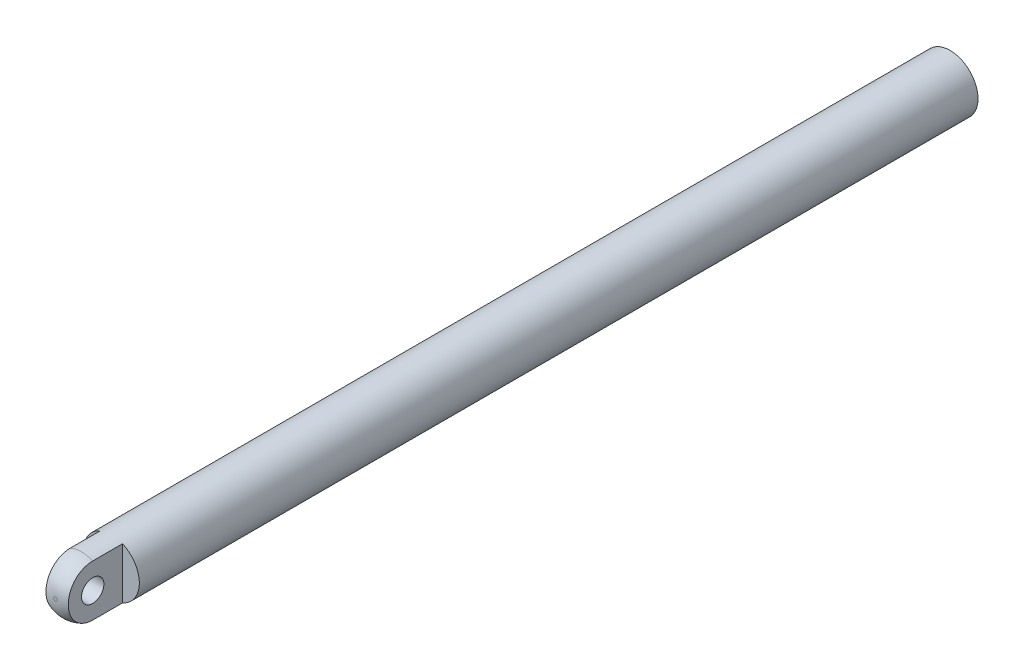
ISO-10303-21;
HEADER;
FILE_DESCRIPTION(('STEP AP214'),'2;1');
FILE_NAME('part.step','',(''),(''),'','','');
FILE_SCHEMA(('AUTOMOTIVE_DESIGN { 1 0 10303 214 1 1 1 1 }'));
ENDSEC;
DATA;
#1=APPLICATION_CONTEXT('core data for automotive mechanical design processes');
#2=APPLICATION_PROTOCOL_DEFINITION('international standard','automotive_design',2000,#1);
#3=PRODUCT_CONTEXT('',#1,'mechanical');
#4=PRODUCT('Part','Part','',(#3));
#5=PRODUCT_RELATED_PRODUCT_CATEGORY('part','',(#4));
#6=PRODUCT_DEFINITION_FORMATION('','',#4);
#7=PRODUCT_DEFINITION_CONTEXT('part definition',#1,'design');
#8=PRODUCT_DEFINITION('design','',#6,#7);
#9=PRODUCT_DEFINITION_SHAPE('','',#8);
#10=(LENGTH_UNIT() NAMED_UNIT(*) SI_UNIT(.MILLI.,.METRE.));
#11=(NAMED_UNIT(*) PLANE_ANGLE_UNIT() SI_UNIT($,.RADIAN.));
#12=(NAMED_UNIT(*) SI_UNIT($,.STERADIAN.) SOLID_ANGLE_UNIT());
#13=UNCERTAINTY_MEASURE_WITH_UNIT(LENGTH_MEASURE(1.E-05),#10,'distance_accuracy_value','');
#14=(GEOMETRIC_REPRESENTATION_CONTEXT(3) GLOBAL_UNCERTAINTY_ASSIGNED_CONTEXT((#13)) GLOBAL_UNIT_ASSIGNED_CONTEXT((#10,
#11,#12)) REPRESENTATION_CONTEXT('',''));
#15=CARTESIAN_POINT('',(0.,0.,0.));
#16=DIRECTION('',(0.,0.,1.));
#17=DIRECTION('',(1.,0.,0.));
#18=AXIS2_PLACEMENT_3D('',#15,#16,#17);
#19=CARTESIAN_POINT('',(0.,0.,828.));
#20=DIRECTION('',(0.,0.,-1.));
#21=DIRECTION('',(-1.,0.,0.));
#22=AXIS2_PLACEMENT_3D('',#19,#20,#21);
#23=CYLINDRICAL_SURFACE('',#22,25.875);
#24=DIRECTION('',(0.,0.,-1.));
#25=VECTOR('',#24,1.);
#26=CARTESIAN_POINT('',(10.35,-23.7148292213965,828.));
#27=LINE('',#26,#25);
#28=CARTESIAN_POINT('',(10.35,-23.7148292213965,776.25));
#29=VERTEX_POINT('',#28);
#30=CARTESIAN_POINT('',(10.35,-23.7148292213965,803.85));
#31=VERTEX_POINT('',#30);
#32=EDGE_CURVE('E92',#29,#31,#27,.F.);
#33=ORIENTED_EDGE('',*,*,#32,.T.);
#34=CARTESIAN_POINT('',(0.,0.,803.85));
#35=DIRECTION('',(0.,0.,1.));
#36=DIRECTION('',(1.,0.,0.));
#37=AXIS2_PLACEMENT_3D('',#34,#35,#36);
#38=CIRCLE('',#37,25.875);
#39=CARTESIAN_POINT('',(-10.35,-23.7148292213965,803.85));
#40=VERTEX_POINT('',#39);
#41=EDGE_CURVE('E122',#31,#40,#38,.F.);
#42=ORIENTED_EDGE('',*,*,#41,.T.);
#43=DIRECTION('',(0.,0.,-1.));
#44=VECTOR('',#43,1.);
#45=CARTESIAN_POINT('',(-10.35,-23.7148292213965,828.));
#46=LINE('',#45,#44);
#47=CARTESIAN_POINT('',(-10.35,-23.7148292213965,776.25));
#48=VERTEX_POINT('',#47);
#49=EDGE_CURVE('E113',#40,#48,#46,.T.);
#50=ORIENTED_EDGE('',*,*,#49,.T.);
#51=CARTESIAN_POINT('',(0.,0.,776.25));
#52=DIRECTION('',(0.,0.,-1.));
#53=DIRECTION('',(-1.,0.,0.));
#54=AXIS2_PLACEMENT_3D('',#51,#52,#53);
#55=CIRCLE('',#54,25.875);
#56=CARTESIAN_POINT('',(-10.35,23.7148292213965,776.25));
#57=VERTEX_POINT('',#56);
#58=EDGE_CURVE('E98',#48,#57,#55,.T.);
#59=ORIENTED_EDGE('',*,*,#58,.T.);
#60=DIRECTION('',(0.,0.,-1.));
#61=VECTOR('',#60,1.);
#62=CARTESIAN_POINT('',(-10.35,23.7148292213965,828.));
#63=LINE('',#62,#61);
#64=CARTESIAN_POINT('',(-10.35,23.7148292213965,803.85));
#65=VERTEX_POINT('',#64);
#66=EDGE_CURVE('E111',#57,#65,#63,.F.);
#67=ORIENTED_EDGE('',*,*,#66,.T.);
#68=CARTESIAN_POINT('',(0.,0.,803.85));
#69=DIRECTION('',(0.,0.,1.));
#70=DIRECTION('',(1.,0.,0.));
#71=AXIS2_PLACEMENT_3D('',#68,#69,#70);
#72=CIRCLE('',#71,25.875);
#73=CARTESIAN_POINT('',(10.35,23.7148292213965,803.85));
#74=VERTEX_POINT('',#73);
#75=EDGE_CURVE('E87',#65,#74,#72,.F.);
#76=ORIENTED_EDGE('',*,*,#75,.T.);
#77=DIRECTION('',(0.,0.,-1.));
#78=VECTOR('',#77,1.);
#79=CARTESIAN_POINT('',(10.35,23.7148292213965,828.));
#80=LINE('',#79,#78);
#81=CARTESIAN_POINT('',(10.35,23.7148292213965,776.25));
#82=VERTEX_POINT('',#81);
#83=EDGE_CURVE('E81',#74,#82,#80,.T.);
#84=ORIENTED_EDGE('',*,*,#83,.T.);
#85=CARTESIAN_POINT('',(0.,0.,776.25));
#86=DIRECTION('',(0.,0.,-1.));
#87=DIRECTION('',(-1.,0.,0.));
#88=AXIS2_PLACEMENT_3D('',#85,#86,#87);
#89=CIRCLE('',#88,25.875);
#90=EDGE_CURVE('E85',#82,#29,#89,.T.);
#91=ORIENTED_EDGE('',*,*,#90,.T.);
#92=EDGE_LOOP('',(#33,#42,#50,#59,#67,#76,#84,#91));
#93=FACE_BOUND('',#92,.T.);
#94=CARTESIAN_POINT('',(0.,0.,0.));
#95=DIRECTION('',(0.,0.,1.));
#96=DIRECTION('',(1.,0.,0.));
#97=AXIS2_PLACEMENT_3D('',#94,#95,#96);
#98=CIRCLE('',#97,25.875);
#99=CARTESIAN_POINT('',(25.875,0.,0.));
#100=VERTEX_POINT('',#99);
#101=EDGE_CURVE('E115',#100,#100,#98,.T.);
#102=ORIENTED_EDGE('',*,*,#101,.T.);
#103=EDGE_LOOP('',(#102));
#104=FACE_BOUND('',#103,.T.);
#105=ADVANCED_FACE('F35',(#93,#104),#23,.T.);
#106=CARTESIAN_POINT('',(0.,0.,828.));
#107=DIRECTION('',(0.,0.,1.));
#108=DIRECTION('',(1.,0.,0.));
#109=AXIS2_PLACEMENT_3D('',#106,#107,#108);
#110=PLANE('',#109);
#111=CARTESIAN_POINT('',(0.,0.,828.));
#112=DIRECTION('',(0.,0.,1.));
#113=DIRECTION('',(1.,0.,0.));
#114=AXIS2_PLACEMENT_3D('',#111,#112,#113);
#115=CIRCLE('',#114,1.725);
#116=CARTESIAN_POINT('',(0.689999999999999,1.58098861475976,828.));
#117=VERTEX_POINT('',#116);
#118=EDGE_CURVE('E53',#117,#117,#115,.T.);
#119=ORIENTED_EDGE('',*,*,#118,.T.);
#120=EDGE_LOOP('',(#119));
#121=FACE_BOUND('',#120,.T.);
#122=ADVANCED_FACE('F135',(#121),#110,.T.);
#123=CARTESIAN_POINT('',(0.,0.,0.));
#124=DIRECTION('',(0.,0.,1.));
#125=DIRECTION('',(1.,0.,0.));
#126=AXIS2_PLACEMENT_3D('',#123,#124,#125);
#127=PLANE('',#126);
#128=CARTESIAN_POINT('',(0.,0.,0.));
#129=DIRECTION('',(0.,0.,-1.));
#130=DIRECTION('',(-1.,0.,0.));
#131=AXIS2_PLACEMENT_3D('',#128,#129,#130);
#132=CIRCLE('',#131,20.7);
#133=CARTESIAN_POINT('',(-20.7,0.,0.));
#134=VERTEX_POINT('',#133);
#135=EDGE_CURVE('E233',#134,#134,#132,.T.);
#136=ORIENTED_EDGE('',*,*,#135,.F.);
#137=EDGE_LOOP('',(#136));
#138=FACE_BOUND('',#137,.T.);
#139=ORIENTED_EDGE('',*,*,#101,.F.);
#140=EDGE_LOOP('',(#139));
#141=FACE_BOUND('',#140,.T.);
#142=ADVANCED_FACE('F138',(#138,#141),#127,.F.);
#143=CARTESIAN_POINT('',(0.,0.,776.25));
#144=DIRECTION('',(0.,0.,-1.));
#145=DIRECTION('',(-1.,0.,0.));
#146=AXIS2_PLACEMENT_3D('',#143,#144,#145);
#147=PLANE('',#146);
#148=DIRECTION('',(0.,1.,0.));
#149=VECTOR('',#148,1.);
#150=CARTESIAN_POINT('',(-10.35,25.875,776.25));
#151=LINE('',#150,#149);
#152=EDGE_CURVE('E91',#48,#57,#151,.T.);
#153=ORIENTED_EDGE('',*,*,#152,.T.);
#154=ORIENTED_EDGE('',*,*,#58,.F.);
#155=EDGE_LOOP('',(#153,#154));
#156=FACE_BOUND('',#155,.T.);
#157=ADVANCED_FACE('F133',(#156),#147,.F.);
#158=CARTESIAN_POINT('',(-10.35,25.875,776.25));
#159=DIRECTION('',(1.,0.,0.));
#160=DIRECTION('',(0.,0.,-1.));
#161=AXIS2_PLACEMENT_3D('',#158,#159,#160);
#162=PLANE('',#161);
#163=CARTESIAN_POINT('',(-10.35,0.,803.85));
#164=DIRECTION('',(1.,0.,0.));
#165=DIRECTION('',(0.,0.,-1.));
#166=AXIS2_PLACEMENT_3D('',#163,#164,#165);
#167=CIRCLE('',#166,10.3499999999999);
#168=CARTESIAN_POINT('',(-10.35,0.,793.5));
#169=VERTEX_POINT('',#168);
#170=EDGE_CURVE('E101',#169,#169,#167,.T.);
#171=ORIENTED_EDGE('',*,*,#170,.T.);
#172=EDGE_LOOP('',(#171));
#173=FACE_BOUND('',#172,.T.);
#174=ORIENTED_EDGE('',*,*,#49,.F.);
#175=CARTESIAN_POINT('',(-10.35,-23.7148292213965,803.85));
#176=CARTESIAN_POINT('',(-10.35,-23.714829701664,804.161953809232));
#177=CARTESIAN_POINT('',(-10.35,-23.7082334123339,804.473872744437));
#178=CARTESIAN_POINT('',(-10.35,-23.6818672963365,805.097145752494));
#179=CARTESIAN_POINT('',(-10.35,-23.6620977894885,805.408499838875));
#180=CARTESIAN_POINT('',(-10.35,-23.5830732426418,806.340826452366));
#181=CARTESIAN_POINT('',(-10.35,-23.5041021531613,806.96023293792));
#182=CARTESIAN_POINT('',(-10.35,-23.2942428456223,808.189552803804));
#183=CARTESIAN_POINT('',(-10.35,-23.1634062603026,808.799475000206));
#184=CARTESIAN_POINT('',(-10.35,-22.9290107187955,809.704289381778));
#185=CARTESIAN_POINT('',(-10.35,-22.8445177000282,810.004228536272));
#186=CARTESIAN_POINT('',(-10.35,-22.6629445504835,810.600355785194));
#187=CARTESIAN_POINT('',(-10.35,-22.5658612241324,810.896542906289));
#188=CARTESIAN_POINT('',(-10.35,-22.2559580324825,811.778706680151));
#189=CARTESIAN_POINT('',(-10.35,-22.0244956893308,812.358244330141));
#190=CARTESIAN_POINT('',(-10.35,-21.513617431329,813.495782772192));
#191=CARTESIAN_POINT('',(-10.35,-21.2342013033755,814.05378346853));
#192=CARTESIAN_POINT('',(-10.35,-20.7807439922447,814.871598332807));
#193=CARTESIAN_POINT('',(-10.35,-20.6238478707108,815.141037681538));
#194=CARTESIAN_POINT('',(-10.35,-20.2989266440864,815.673023450699));
#195=CARTESIAN_POINT('',(-10.35,-20.1309044042367,815.935571621639));
#196=CARTESIAN_POINT('',(-10.35,-19.6105050229041,816.712338092453));
#197=CARTESIAN_POINT('',(-10.35,-19.2417665943304,817.215729949956));
#198=CARTESIAN_POINT('',(-10.35,-18.4624043372414,818.191323313728));
#199=CARTESIAN_POINT('',(-10.35,-18.051658993194,818.663427426908));
#200=CARTESIAN_POINT('',(-10.35,-17.1921787273976,819.571707263641));
#201=CARTESIAN_POINT('',(-10.35,-16.7434437941847,820.007882976353));
#202=CARTESIAN_POINT('',(-10.35,-15.811317517307,820.841428160986));
#203=CARTESIAN_POINT('',(-10.35,-15.3279273189899,821.238798914376));
#204=CARTESIAN_POINT('',(-10.35,-14.3300175646697,821.992302099174));
#205=CARTESIAN_POINT('',(-10.35,-13.8154977677075,822.34843421131));
#206=CARTESIAN_POINT('',(-10.35,-12.7517319803209,823.022089033752));
#207=CARTESIAN_POINT('',(-10.35,-12.2021027746864,823.339006427801));
#208=CARTESIAN_POINT('',(-10.35,-11.0787715509974,823.926784889523));
#209=CARTESIAN_POINT('',(-10.35,-10.5050695073887,824.197645908304));
#210=CARTESIAN_POINT('',(-10.35,-9.33771939904055,824.692343127394));
#211=CARTESIAN_POINT('',(-10.35,-8.74407003580255,824.916176259449));
#212=CARTESIAN_POINT('',(-10.35,-7.54103524936923,825.316465599933));
#213=CARTESIAN_POINT('',(-10.35,-6.93164944452512,825.492920658136));
#214=CARTESIAN_POINT('',(-10.35,-5.6724537107978,825.805920684026));
#215=CARTESIAN_POINT('',(-10.35,-5.02208523598843,825.940216142262));
#216=CARTESIAN_POINT('',(-10.35,-3.71296538188485,826.158235776255));
#217=CARTESIAN_POINT('',(-10.35,-3.05421356684496,826.24195731225));
#218=CARTESIAN_POINT('',(-10.35,-1.73156751579626,826.360062604129));
#219=CARTESIAN_POINT('',(-10.35,-1.06766859322826,826.394394287863));
#220=CARTESIAN_POINT('',(-10.35,-0.0714284123076251,826.409243998624));
#221=CARTESIAN_POINT('',(-10.35,0.260734570053346,826.408084899825));
#222=CARTESIAN_POINT('',(-10.35,0.924883625815486,826.393532581459));
#223=CARTESIAN_POINT('',(-10.35,1.25686962062334,826.380135835486));
#224=CARTESIAN_POINT('',(-10.35,2.3286852463131,826.316963652836));
#225=CARTESIAN_POINT('',(-10.35,3.06724160613928,826.24270488582));
#226=CARTESIAN_POINT('',(-10.35,4.5352423709924,826.031481335104));
#227=CARTESIAN_POINT('',(-10.35,5.26468746614211,825.894521330593));
#228=CARTESIAN_POINT('',(-10.35,6.70798875412105,825.556509701301));
#229=CARTESIAN_POINT('',(-10.35,7.42185832062232,825.355515574842));
#230=CARTESIAN_POINT('',(-10.35,8.82812917357935,824.888796143396));
#231=CARTESIAN_POINT('',(-10.35,9.52053203903945,824.62307561222));
#232=CARTESIAN_POINT('',(-10.35,10.8471368593451,824.040735346576));
#233=CARTESIAN_POINT('',(-10.35,11.4825581877362,823.726894109638));
#234=CARTESIAN_POINT('',(-10.35,12.7219642177284,823.042219306712));
#235=CARTESIAN_POINT('',(-10.35,13.3259488931057,822.671385693182));
#236=CARTESIAN_POINT('',(-10.35,14.4969346256821,821.875143979434));
#237=CARTESIAN_POINT('',(-10.35,15.0639309683793,821.449728942736));
#238=CARTESIAN_POINT('',(-10.35,16.1555180782463,820.547611933376));
#239=CARTESIAN_POINT('',(-10.35,16.6801120854646,820.070913885854));
#240=CARTESIAN_POINT('',(-10.35,17.636973804159,819.115102378269));
#241=CARTESIAN_POINT('',(-10.35,18.0733021657599,818.640045409694));
#242=CARTESIAN_POINT('',(-10.35,18.9033295089765,817.654071710571));
#243=CARTESIAN_POINT('',(-10.35,19.297031355172,817.143157393511));
#244=CARTESIAN_POINT('',(-10.35,20.0385657013276,816.089400165883));
#245=CARTESIAN_POINT('',(-10.35,20.386418793595,815.546571748579));
#246=CARTESIAN_POINT('',(-10.35,21.0337302656077,814.43280656569));
#247=CARTESIAN_POINT('',(-10.35,21.3331888359675,813.86186991083));
#248=CARTESIAN_POINT('',(-10.35,21.8743816978838,812.710961903239));
#249=CARTESIAN_POINT('',(-10.35,22.1173953818391,812.131594117874));
#250=CARTESIAN_POINT('',(-10.35,22.4443621387265,811.248849986102));
#251=CARTESIAN_POINT('',(-10.35,22.5470953254847,810.952308196569));
#252=CARTESIAN_POINT('',(-10.35,22.7399127151702,810.355052940614));
#253=CARTESIAN_POINT('',(-10.35,22.8299935887414,810.054338398954));
#254=CARTESIAN_POINT('',(-10.35,23.0809418033355,809.146865669407));
#255=CARTESIAN_POINT('',(-10.35,23.2225539716562,808.534672428233));
#256=CARTESIAN_POINT('',(-10.35,23.4532512072847,807.300468688526));
#257=CARTESIAN_POINT('',(-10.35,23.5423365360061,806.678458238867));
#258=CARTESIAN_POINT('',(-10.35,23.6358537206299,805.743939613519));
#259=CARTESIAN_POINT('',(-10.35,23.6603236798486,805.433327973755));
#260=CARTESIAN_POINT('',(-10.35,23.6961313510996,804.811429205336));
#261=CARTESIAN_POINT('',(-10.35,23.7074724681571,804.500142272814));
#262=CARTESIAN_POINT('',(-10.35,23.7217661601151,803.565930058798));
#263=CARTESIAN_POINT('',(-10.35,23.7049945304472,802.942598780503));
#264=CARTESIAN_POINT('',(-10.35,23.6188947673787,801.699094130684));
#265=CARTESIAN_POINT('',(-10.35,23.5495261811984,801.078923559867));
#266=CARTESIAN_POINT('',(-10.35,23.4064538891047,800.154837251641));
#267=CARTESIAN_POINT('',(-10.35,23.3522501190911,799.847796457599));
#268=CARTESIAN_POINT('',(-10.35,23.2309319189982,799.236268763559));
#269=CARTESIAN_POINT('',(-10.35,23.1638171901733,798.931781922828));
#270=CARTESIAN_POINT('',(-10.35,23.0902974859345,798.628813705402));
#271=B_SPLINE_CURVE_WITH_KNOTS('',3,(#175,#176,#177,#178,#179,#180,#181,#182,#183,#184,#185,
#186,#187,#188,#189,#190,#191,#192,#193,#194,#195,#196,#197,#198,#199,#200,#201,#202,#203,#204,
#205,#206,#207,#208,#209,#210,#211,#212,#213,#214,#215,#216,#217,#218,#219,#220,#221,#222,#223,
#224,#225,#226,#227,#228,#229,#230,#231,#232,#233,#234,#235,#236,#237,#238,#239,#240,#241,#242,
#243,#244,#245,#246,#247,#248,#249,#250,#251,#252,#253,#254,#255,#256,#257,#258,#259,#260,#261,
#262,#263,#264,#265,#266,#267,#268,#269,#270),.UNSPECIFIED.,.F.,.F.,(4,2,2,2,2,2,2,2,2,2,2,2,2,
2,2,2,2,2,2,2,2,2,2,2,2,2,2,2,2,2,2,2,2,2,2,2,2,2,2,2,2,2,2,2,2,2,2,4),(0.,0.93572209640375,
1.87142147617674,3.74231308389242,5.61134685454331,6.54594305331017,7.48077692996032,
9.35057261247,11.2203766044478,12.1555096086352,13.0904027233486,14.9600124924065,
16.835192360012,18.7103727934788,20.5854912812411,22.4606242852358,24.3618153482398,
26.2630084294879,28.1643255122423,30.0656887501675,32.0558752926582,34.0461657061856,
36.0385529661961,37.0348522546128,38.0314387277259,40.2554316404289,42.479255065056,
44.7010872478194,46.9227556119082,49.0459387470401,51.169123653268,53.2925786522442,
55.4158712400131,57.3486013190895,59.2812014344494,61.2129305708574,63.1446520984618,
65.0270170309226,65.9682719114681,66.9097740136143,68.7924403969312,70.6750974105867,
71.6095772659808,72.5438147054147,74.4121255632337,76.2818748146895,77.2169973341521,
78.1521414939409),.UNSPECIFIED.);
#272=EDGE_CURVE('E48',#40,#65,#271,.T.);
#273=ORIENTED_EDGE('',*,*,#272,.T.);
#274=ORIENTED_EDGE('',*,*,#66,.F.);
#275=ORIENTED_EDGE('',*,*,#152,.F.);
#276=EDGE_LOOP('',(#174,#273,#274,#275));
#277=FACE_BOUND('',#276,.T.);
#278=ADVANCED_FACE('F128',(#173,#277),#162,.F.);
#279=CARTESIAN_POINT('',(0.,0.,776.25));
#280=DIRECTION('',(0.,0.,-1.));
#281=DIRECTION('',(-1.,0.,0.));
#282=AXIS2_PLACEMENT_3D('',#279,#280,#281);
#283=PLANE('',#282);
#284=DIRECTION('',(0.,-1.,0.));
#285=VECTOR('',#284,1.);
#286=CARTESIAN_POINT('',(10.35,25.875,776.25));
#287=LINE('',#286,#285);
#288=EDGE_CURVE('E97',#82,#29,#287,.T.);
#289=ORIENTED_EDGE('',*,*,#288,.T.);
#290=ORIENTED_EDGE('',*,*,#90,.F.);
#291=EDGE_LOOP('',(#289,#290));
#292=FACE_BOUND('',#291,.T.);
#293=ADVANCED_FACE('F96',(#292),#283,.F.);
#294=CARTESIAN_POINT('',(10.35,25.875,776.25));
#295=DIRECTION('',(-1.,0.,0.));
#296=DIRECTION('',(0.,0.,1.));
#297=AXIS2_PLACEMENT_3D('',#294,#295,#296);
#298=PLANE('',#297);
#299=CARTESIAN_POINT('',(10.35,0.,803.85));
#300=DIRECTION('',(1.,0.,0.));
#301=DIRECTION('',(0.,0.,-1.));
#302=AXIS2_PLACEMENT_3D('',#299,#300,#301);
#303=CIRCLE('',#302,10.3499999999999);
#304=CARTESIAN_POINT('',(10.35,0.,793.5));
#305=VERTEX_POINT('',#304);
#306=EDGE_CURVE('E105',#305,#305,#303,.T.);
#307=ORIENTED_EDGE('',*,*,#306,.F.);
#308=EDGE_LOOP('',(#307));
#309=FACE_BOUND('',#308,.T.);
#310=ORIENTED_EDGE('',*,*,#83,.F.);
#311=CARTESIAN_POINT('',(10.35,23.7148292213965,803.85));
#312=CARTESIAN_POINT('',(10.35,23.714829701664,804.161953809232));
#313=CARTESIAN_POINT('',(10.35,23.7082334123339,804.473872744437));
#314=CARTESIAN_POINT('',(10.35,23.6818672963365,805.097145752494));
#315=CARTESIAN_POINT('',(10.35,23.6620977894885,805.408499838875));
#316=CARTESIAN_POINT('',(10.35,23.5830732426418,806.340826452366));
#317=CARTESIAN_POINT('',(10.35,23.5041021531613,806.96023293792));
#318=CARTESIAN_POINT('',(10.35,23.2942428456223,808.189552803804));
#319=CARTESIAN_POINT('',(10.35,23.1634062603026,808.799475000206));
#320=CARTESIAN_POINT('',(10.35,22.9290107187955,809.704289381778));
#321=CARTESIAN_POINT('',(10.35,22.8445177000282,810.004228536272));
#322=CARTESIAN_POINT('',(10.35,22.6629445504835,810.600355785194));
#323=CARTESIAN_POINT('',(10.35,22.5658612241324,810.896542906289));
#324=CARTESIAN_POINT('',(10.35,22.2559580324825,811.778706680151));
#325=CARTESIAN_POINT('',(10.35,22.0244956893308,812.358244330141));
#326=CARTESIAN_POINT('',(10.35,21.513617431329,813.495782772192));
#327=CARTESIAN_POINT('',(10.35,21.2342013033755,814.05378346853));
#328=CARTESIAN_POINT('',(10.35,20.7807439922447,814.871598332807));
#329=CARTESIAN_POINT('',(10.35,20.6238478707108,815.141037681538));
#330=CARTESIAN_POINT('',(10.35,20.2989266440864,815.673023450699));
#331=CARTESIAN_POINT('',(10.35,20.1309044042367,815.935571621639));
#332=CARTESIAN_POINT('',(10.35,19.6105050229041,816.712338092453));
#333=CARTESIAN_POINT('',(10.35,19.2417665943304,817.215729949956));
#334=CARTESIAN_POINT('',(10.35,18.4624043372414,818.191323313728));
#335=CARTESIAN_POINT('',(10.35,18.051658993194,818.663427426908));
#336=CARTESIAN_POINT('',(10.35,17.1921787273976,819.571707263641));
#337=CARTESIAN_POINT('',(10.35,16.7434437941847,820.007882976353));
#338=CARTESIAN_POINT('',(10.35,15.811317517307,820.841428160986));
#339=CARTESIAN_POINT('',(10.35,15.3279273189899,821.238798914376));
#340=CARTESIAN_POINT('',(10.35,14.3300175646697,821.992302099174));
#341=CARTESIAN_POINT('',(10.35,13.8154977677075,822.34843421131));
#342=CARTESIAN_POINT('',(10.35,12.7517319803209,823.022089033752));
#343=CARTESIAN_POINT('',(10.35,12.2021027746864,823.339006427801));
#344=CARTESIAN_POINT('',(10.35,11.0787715509974,823.926784889523));
#345=CARTESIAN_POINT('',(10.35,10.5050695073887,824.197645908304));
#346=CARTESIAN_POINT('',(10.35,9.33771939904055,824.692343127394));
#347=CARTESIAN_POINT('',(10.35,8.74407003580255,824.916176259449));
#348=CARTESIAN_POINT('',(10.35,7.54103524936923,825.316465599933));
#349=CARTESIAN_POINT('',(10.35,6.93164944452512,825.492920658136));
#350=CARTESIAN_POINT('',(10.35,5.6724537107978,825.805920684026));
#351=CARTESIAN_POINT('',(10.35,5.02208523598843,825.940216142262));
#352=CARTESIAN_POINT('',(10.35,3.71296538188485,826.158235776255));
#353=CARTESIAN_POINT('',(10.35,3.05421356684496,826.24195731225));
#354=CARTESIAN_POINT('',(10.35,1.73156751579626,826.360062604129));
#355=CARTESIAN_POINT('',(10.35,1.06766859322826,826.394394287863));
#356=CARTESIAN_POINT('',(10.35,0.0714284123076251,826.409243998624));
#357=CARTESIAN_POINT('',(10.35,-0.260734570053346,826.408084899825));
#358=CARTESIAN_POINT('',(10.35,-0.924883625815486,826.393532581459));
#359=CARTESIAN_POINT('',(10.35,-1.25686962062334,826.380135835486));
#360=CARTESIAN_POINT('',(10.35,-2.3286852463131,826.316963652836));
#361=CARTESIAN_POINT('',(10.35,-3.06724160613928,826.24270488582));
#362=CARTESIAN_POINT('',(10.35,-4.5352423709924,826.031481335104));
#363=CARTESIAN_POINT('',(10.35,-5.26468746614211,825.894521330593));
#364=CARTESIAN_POINT('',(10.35,-6.70798875412105,825.556509701301));
#365=CARTESIAN_POINT('',(10.35,-7.42185832062232,825.355515574842));
#366=CARTESIAN_POINT('',(10.35,-8.82812917357935,824.888796143396));
#367=CARTESIAN_POINT('',(10.35,-9.52053203903945,824.62307561222));
#368=CARTESIAN_POINT('',(10.35,-10.8471368593451,824.040735346576));
#369=CARTESIAN_POINT('',(10.35,-11.4825581877362,823.726894109638));
#370=CARTESIAN_POINT('',(10.35,-12.7219642177284,823.042219306712));
#371=CARTESIAN_POINT('',(10.35,-13.3259488931057,822.671385693182));
#372=CARTESIAN_POINT('',(10.35,-14.4969346256821,821.875143979434));
#373=CARTESIAN_POINT('',(10.35,-15.0639309683793,821.449728942736));
#374=CARTESIAN_POINT('',(10.35,-16.1555180782463,820.547611933376));
#375=CARTESIAN_POINT('',(10.35,-16.6801120854646,820.070913885854));
#376=CARTESIAN_POINT('',(10.35,-17.636973804159,819.115102378269));
#377=CARTESIAN_POINT('',(10.35,-18.0733021657599,818.640045409694));
#378=CARTESIAN_POINT('',(10.35,-18.9033295089765,817.654071710571));
#379=CARTESIAN_POINT('',(10.35,-19.297031355172,817.143157393511));
#380=CARTESIAN_POINT('',(10.35,-20.0385657013276,816.089400165883));
#381=CARTESIAN_POINT('',(10.35,-20.386418793595,815.546571748579));
#382=CARTESIAN_POINT('',(10.35,-21.0337302656077,814.43280656569));
#383=CARTESIAN_POINT('',(10.35,-21.3331888359675,813.86186991083));
#384=CARTESIAN_POINT('',(10.35,-21.8743816978838,812.710961903239));
#385=CARTESIAN_POINT('',(10.35,-22.1173953818391,812.131594117874));
#386=CARTESIAN_POINT('',(10.35,-22.4443621387265,811.248849986102));
#387=CARTESIAN_POINT('',(10.35,-22.5470953254847,810.952308196569));
#388=CARTESIAN_POINT('',(10.35,-22.7399127151702,810.355052940614));
#389=CARTESIAN_POINT('',(10.35,-22.8299935887414,810.054338398954));
#390=CARTESIAN_POINT('',(10.35,-23.0809418033355,809.146865669407));
#391=CARTESIAN_POINT('',(10.35,-23.2225539716562,808.534672428233));
#392=CARTESIAN_POINT('',(10.35,-23.4532512072847,807.300468688526));
#393=CARTESIAN_POINT('',(10.35,-23.5423365360061,806.678458238867));
#394=CARTESIAN_POINT('',(10.35,-23.6358537206299,805.743939613519));
#395=CARTESIAN_POINT('',(10.35,-23.6603236798486,805.433327973755));
#396=CARTESIAN_POINT('',(10.35,-23.6961313510996,804.811429205336));
#397=CARTESIAN_POINT('',(10.35,-23.7074724681571,804.500142272814));
#398=CARTESIAN_POINT('',(10.35,-23.7217661601151,803.565930058798));
#399=CARTESIAN_POINT('',(10.35,-23.7049945304472,802.942598780503));
#400=CARTESIAN_POINT('',(10.35,-23.6188947673787,801.699094130684));
#401=CARTESIAN_POINT('',(10.35,-23.5495261811984,801.078923559867));
#402=CARTESIAN_POINT('',(10.35,-23.4064538891047,800.154837251641));
#403=CARTESIAN_POINT('',(10.35,-23.3522501190911,799.847796457599));
#404=CARTESIAN_POINT('',(10.35,-23.2309319189982,799.236268763559));
#405=CARTESIAN_POINT('',(10.35,-23.1638171901733,798.931781922828));
#406=CARTESIAN_POINT('',(10.35,-23.0902974859345,798.628813705402));
#407=B_SPLINE_CURVE_WITH_KNOTS('',3,(#311,#312,#313,#314,#315,#316,#317,#318,#319,#320,#321,
#322,#323,#324,#325,#326,#327,#328,#329,#330,#331,#332,#333,#334,#335,#336,#337,#338,#339,#340,
#341,#342,#343,#344,#345,#346,#347,#348,#349,#350,#351,#352,#353,#354,#355,#356,#357,#358,#359,
#360,#361,#362,#363,#364,#365,#366,#367,#368,#369,#370,#371,#372,#373,#374,#375,#376,#377,#378,
#379,#380,#381,#382,#383,#384,#385,#386,#387,#388,#389,#390,#391,#392,#393,#394,#395,#396,#397,
#398,#399,#400,#401,#402,#403,#404,#405,#406),.UNSPECIFIED.,.F.,.F.,(4,2,2,2,2,2,2,2,2,2,2,2,2,
2,2,2,2,2,2,2,2,2,2,2,2,2,2,2,2,2,2,2,2,2,2,2,2,2,2,2,2,2,2,2,2,2,2,4),(0.,0.93572209640375,
1.87142147617674,3.74231308389242,5.61134685454331,6.54594305331017,7.48077692996032,
9.35057261247,11.2203766044478,12.1555096086352,13.0904027233486,14.9600124924065,
16.835192360012,18.7103727934788,20.5854912812411,22.4606242852358,24.3618153482398,
26.2630084294879,28.1643255122423,30.0656887501675,32.0558752926582,34.0461657061856,
36.0385529661961,37.0348522546128,38.0314387277259,40.2554316404289,42.479255065056,
44.7010872478194,46.9227556119082,49.0459387470401,51.169123653268,53.2925786522442,
55.4158712400131,57.3486013190895,59.2812014344494,61.2129305708574,63.1446520984618,
65.0270170309226,65.9682719114681,66.9097740136143,68.7924403969312,70.6750974105867,
71.6095772659808,72.5438147054147,74.4121255632337,76.2818748146895,77.2169973341521,
78.1521414939409),.UNSPECIFIED.);
#408=EDGE_CURVE('E11',#74,#31,#407,.T.);
#409=ORIENTED_EDGE('',*,*,#408,.T.);
#410=ORIENTED_EDGE('',*,*,#32,.F.);
#411=ORIENTED_EDGE('',*,*,#288,.F.);
#412=EDGE_LOOP('',(#310,#409,#410,#411));
#413=FACE_BOUND('',#412,.T.);
#414=ADVANCED_FACE('F100',(#309,#413),#298,.F.);
#415=CARTESIAN_POINT('',(-41.4,0.,803.85));
#416=DIRECTION('',(1.,0.,0.));
#417=DIRECTION('',(0.,0.,-1.));
#418=AXIS2_PLACEMENT_3D('',#415,#416,#417);
#419=CYLINDRICAL_SURFACE('',#418,10.3499999999999);
#420=ORIENTED_EDGE('',*,*,#306,.T.);
#421=EDGE_LOOP('',(#420));
#422=FACE_BOUND('',#421,.T.);
#423=ORIENTED_EDGE('',*,*,#170,.F.);
#424=EDGE_LOOP('',(#423));
#425=FACE_BOUND('',#424,.T.);
#426=ADVANCED_FACE('F175',(#422,#425),#419,.F.);
#427=CARTESIAN_POINT('',(0.,0.,803.85));
#428=DIRECTION('',(0.,0.,1.));
#429=DIRECTION('',(1.,0.,0.));
#430=AXIS2_PLACEMENT_3D('',#427,#428,#429);
#431=DEGENERATE_TOROIDAL_SURFACE('',#430,1.725,24.15,.T.);
#432=ORIENTED_EDGE('',*,*,#272,.F.);
#433=ORIENTED_EDGE('',*,*,#41,.F.);
#434=ORIENTED_EDGE('',*,*,#408,.F.);
#435=ORIENTED_EDGE('',*,*,#75,.F.);
#436=EDGE_LOOP('',(#432,#433,#434,#435));
#437=FACE_BOUND('',#436,.T.);
#438=ORIENTED_EDGE('',*,*,#118,.F.);
#439=EDGE_LOOP('',(#438));
#440=FACE_BOUND('',#439,.T.);
#441=ADVANCED_FACE('F37',(#437,#440),#431,.T.);
#442=CARTESIAN_POINT('',(0.,0.,759.));
#443=DIRECTION('',(0.,0.,-1.));
#444=DIRECTION('',(-1.,0.,0.));
#445=AXIS2_PLACEMENT_3D('',#442,#443,#444);
#446=CYLINDRICAL_SURFACE('',#445,20.7);
#447=CARTESIAN_POINT('',(0.,0.,759.));
#448=DIRECTION('',(0.,0.,-1.));
#449=DIRECTION('',(-1.,0.,0.));
#450=AXIS2_PLACEMENT_3D('',#447,#448,#449);
#451=CIRCLE('',#450,20.7);
#452=CARTESIAN_POINT('',(-20.7,0.,759.));
#453=VERTEX_POINT('',#452);
#454=EDGE_CURVE('E232',#453,#453,#451,.T.);
#455=ORIENTED_EDGE('',*,*,#454,.F.);
#456=EDGE_LOOP('',(#455));
#457=FACE_BOUND('',#456,.T.);
#458=ORIENTED_EDGE('',*,*,#135,.T.);
#459=EDGE_LOOP('',(#458));
#460=FACE_BOUND('',#459,.T.);
#461=ADVANCED_FACE('F189',(#457,#460),#446,.F.);
#462=CARTESIAN_POINT('',(0.,0.,759.));
#463=DIRECTION('',(0.,0.,-1.));
#464=DIRECTION('',(-1.,0.,0.));
#465=AXIS2_PLACEMENT_3D('',#462,#463,#464);
#466=PLANE('',#465);
#467=ORIENTED_EDGE('',*,*,#454,.T.);
#468=EDGE_LOOP('',(#467));
#469=FACE_BOUND('',#468,.T.);
#470=ADVANCED_FACE('F196',(#469),#466,.T.);
#471=CLOSED_SHELL('',(#105,#122,#142,#157,#278,#293,#414,#426,#441,#461,#470));
#472=MANIFOLD_SOLID_BREP('B2',#471);
#473=ADVANCED_BREP_SHAPE_REPRESENTATION('',(#18,#472),#14);
#474=SHAPE_DEFINITION_REPRESENTATION(#9,#473);
ENDSEC;
END-ISO-10303-21;
